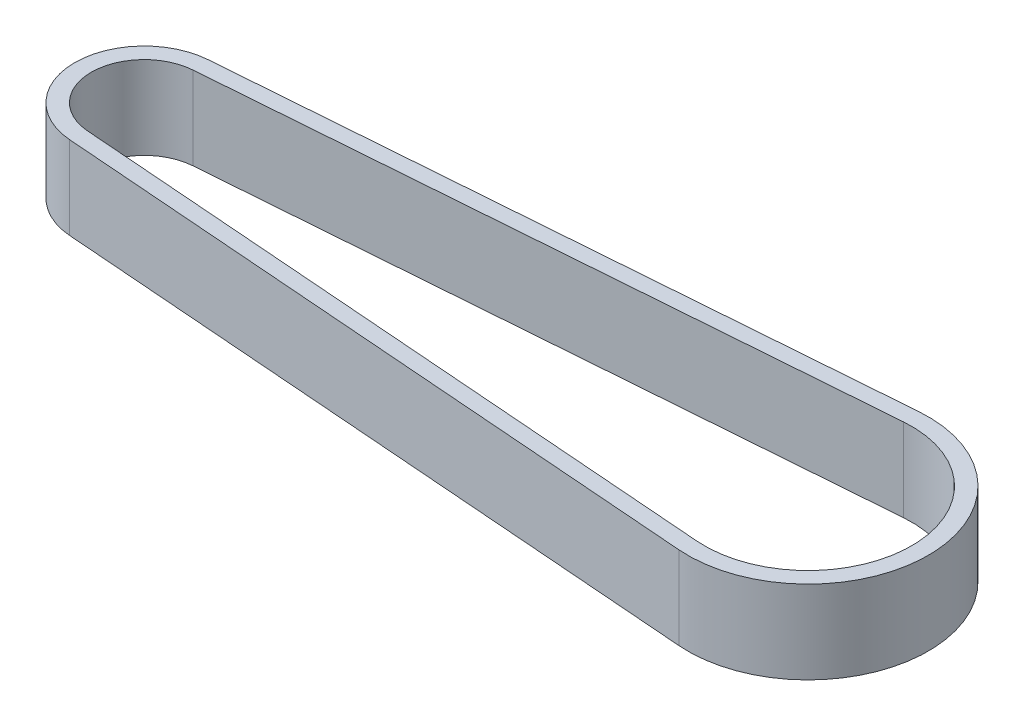
ISO-10303-21;
HEADER;
FILE_DESCRIPTION(('STEP AP214'),'2;1');
FILE_NAME('part.step','',(''),(''),'','','');
FILE_SCHEMA(('AUTOMOTIVE_DESIGN { 1 0 10303 214 1 1 1 1 }'));
ENDSEC;
DATA;
#1=APPLICATION_CONTEXT('core data for automotive mechanical design processes');
#2=APPLICATION_PROTOCOL_DEFINITION('international standard','automotive_design',2000,#1);
#3=PRODUCT_CONTEXT('',#1,'mechanical');
#4=PRODUCT('Part','Part','',(#3));
#5=PRODUCT_RELATED_PRODUCT_CATEGORY('part','',(#4));
#6=PRODUCT_DEFINITION_FORMATION('','',#4);
#7=PRODUCT_DEFINITION_CONTEXT('part definition',#1,'design');
#8=PRODUCT_DEFINITION('design','',#6,#7);
#9=PRODUCT_DEFINITION_SHAPE('','',#8);
#10=(LENGTH_UNIT() NAMED_UNIT(*) SI_UNIT(.MILLI.,.METRE.));
#11=(NAMED_UNIT(*) PLANE_ANGLE_UNIT() SI_UNIT($,.RADIAN.));
#12=(NAMED_UNIT(*) SI_UNIT($,.STERADIAN.) SOLID_ANGLE_UNIT());
#13=UNCERTAINTY_MEASURE_WITH_UNIT(LENGTH_MEASURE(1.E-05),#10,'distance_accuracy_value','');
#14=(GEOMETRIC_REPRESENTATION_CONTEXT(3) GLOBAL_UNCERTAINTY_ASSIGNED_CONTEXT((#13)) GLOBAL_UNIT_ASSIGNED_CONTEXT((#10,
#11,#12)) REPRESENTATION_CONTEXT('',''));
#15=CARTESIAN_POINT('',(0.,0.,0.));
#16=DIRECTION('',(0.,0.,1.));
#17=DIRECTION('',(1.,0.,0.));
#18=AXIS2_PLACEMENT_3D('',#15,#16,#17);
#19=CARTESIAN_POINT('',(0.,10.,0.));
#20=DIRECTION('',(0.,1.,0.));
#21=DIRECTION('',(0.,0.,1.));
#22=AXIS2_PLACEMENT_3D('',#19,#20,#21);
#23=PLANE('',#22);
#24=CARTESIAN_POINT('',(0.,10.,0.));
#25=DIRECTION('',(0.,1.,0.));
#26=DIRECTION('',(0.,0.,1.));
#27=AXIS2_PLACEMENT_3D('',#24,#25,#26);
#28=CIRCLE('',#27,8.37);
#29=CARTESIAN_POINT('',(-0.63925875,10.,-8.34555260306641));
#30=VERTEX_POINT('',#29);
#31=CARTESIAN_POINT('',(-0.63925875,10.,8.34555260306641));
#32=VERTEX_POINT('',#31);
#33=EDGE_CURVE('E134',#30,#32,#28,.T.);
#34=ORIENTED_EDGE('',*,*,#33,.T.);
#35=DIRECTION('',(0.997079164046165,0.,0.076375));
#36=VECTOR('',#35,1.);
#37=CARTESIAN_POINT('',(-0.63925875,10.,8.34555260306641));
#38=LINE('',#37,#36);
#39=CARTESIAN_POINT('',(78.89409,10.,14.4377062953885));
#40=VERTEX_POINT('',#39);
#41=EDGE_CURVE('E137',#32,#40,#38,.T.);
#42=ORIENTED_EDGE('',*,*,#41,.T.);
#43=CARTESIAN_POINT('',(80.,10.,0.));
#44=DIRECTION('',(0.,1.,0.));
#45=DIRECTION('',(0.,0.,1.));
#46=AXIS2_PLACEMENT_3D('',#43,#44,#45);
#47=CIRCLE('',#46,14.48);
#48=CARTESIAN_POINT('',(78.89409,10.,-14.4377062953885));
#49=VERTEX_POINT('',#48);
#50=EDGE_CURVE('E140',#40,#49,#47,.T.);
#51=ORIENTED_EDGE('',*,*,#50,.T.);
#52=DIRECTION('',(-0.997079164046165,0.,0.076375));
#53=VECTOR('',#52,1.);
#54=CARTESIAN_POINT('',(-0.63925875,10.,-8.34555260306641));
#55=LINE('',#54,#53);
#56=EDGE_CURVE('E142',#49,#30,#55,.T.);
#57=ORIENTED_EDGE('',*,*,#56,.T.);
#58=EDGE_LOOP('',(#34,#42,#51,#57));
#59=FACE_BOUND('',#58,.T.);
#60=DIRECTION('',(-0.997079164046165,0.,0.076375));
#61=VECTOR('',#60,1.);
#62=CARTESIAN_POINT('',(-0.48650875,10.,-6.35139427497407));
#63=LINE('',#62,#61);
#64=CARTESIAN_POINT('',(79.04684,10.,-12.4435479672961));
#65=VERTEX_POINT('',#64);
#66=CARTESIAN_POINT('',(-0.48650875,10.,-6.35139427497407));
#67=VERTEX_POINT('',#66);
#68=EDGE_CURVE('E106',#65,#67,#63,.T.);
#69=ORIENTED_EDGE('',*,*,#68,.F.);
#70=CARTESIAN_POINT('',(80.,10.,0.));
#71=DIRECTION('',(0.,1.,0.));
#72=DIRECTION('',(0.,0.,1.));
#73=AXIS2_PLACEMENT_3D('',#70,#71,#72);
#74=CIRCLE('',#73,12.48);
#75=CARTESIAN_POINT('',(79.04684,10.,12.4435479672961));
#76=VERTEX_POINT('',#75);
#77=EDGE_CURVE('E98',#76,#65,#74,.T.);
#78=ORIENTED_EDGE('',*,*,#77,.F.);
#79=DIRECTION('',(0.997079164046165,0.,0.076375));
#80=VECTOR('',#79,1.);
#81=CARTESIAN_POINT('',(-0.48650875,10.,6.35139427497407));
#82=LINE('',#81,#80);
#83=CARTESIAN_POINT('',(-0.486508750000002,10.,6.35139427497407));
#84=VERTEX_POINT('',#83);
#85=EDGE_CURVE('E120',#84,#76,#82,.T.);
#86=ORIENTED_EDGE('',*,*,#85,.F.);
#87=CARTESIAN_POINT('',(0.,10.,0.));
#88=DIRECTION('',(0.,1.,0.));
#89=DIRECTION('',(0.,0.,1.));
#90=AXIS2_PLACEMENT_3D('',#87,#88,#89);
#91=CIRCLE('',#90,6.37);
#92=EDGE_CURVE('E118',#67,#84,#91,.T.);
#93=ORIENTED_EDGE('',*,*,#92,.F.);
#94=EDGE_LOOP('',(#69,#78,#86,#93));
#95=FACE_BOUND('',#94,.T.);
#96=ADVANCED_FACE('F33',(#59,#95),#23,.T.);
#97=CARTESIAN_POINT('',(0.,0.,0.));
#98=DIRECTION('',(0.,1.,0.));
#99=DIRECTION('',(0.,0.,1.));
#100=AXIS2_PLACEMENT_3D('',#97,#98,#99);
#101=PLANE('',#100);
#102=CARTESIAN_POINT('',(0.,0.,0.));
#103=DIRECTION('',(0.,1.,0.));
#104=DIRECTION('',(0.,0.,1.));
#105=AXIS2_PLACEMENT_3D('',#102,#103,#104);
#106=CIRCLE('',#105,8.37);
#107=CARTESIAN_POINT('',(-0.63925875,0.,-8.34555260306641));
#108=VERTEX_POINT('',#107);
#109=CARTESIAN_POINT('',(-0.63925875,0.,8.34555260306641));
#110=VERTEX_POINT('',#109);
#111=EDGE_CURVE('E114',#108,#110,#106,.T.);
#112=ORIENTED_EDGE('',*,*,#111,.F.);
#113=DIRECTION('',(-0.997079164046165,0.,0.076375));
#114=VECTOR('',#113,1.);
#115=CARTESIAN_POINT('',(-0.63925875,0.,-8.34555260306641));
#116=LINE('',#115,#114);
#117=CARTESIAN_POINT('',(78.89409,0.,-14.4377062953885));
#118=VERTEX_POINT('',#117);
#119=EDGE_CURVE('E138',#118,#108,#116,.T.);
#120=ORIENTED_EDGE('',*,*,#119,.F.);
#121=CARTESIAN_POINT('',(80.,0.,0.));
#122=DIRECTION('',(0.,1.,0.));
#123=DIRECTION('',(0.,0.,1.));
#124=AXIS2_PLACEMENT_3D('',#121,#122,#123);
#125=CIRCLE('',#124,14.48);
#126=CARTESIAN_POINT('',(78.89409,0.,14.4377062953885));
#127=VERTEX_POINT('',#126);
#128=EDGE_CURVE('E149',#127,#118,#125,.T.);
#129=ORIENTED_EDGE('',*,*,#128,.F.);
#130=DIRECTION('',(0.997079164046165,0.,0.076375));
#131=VECTOR('',#130,1.);
#132=CARTESIAN_POINT('',(-0.63925875,0.,8.34555260306641));
#133=LINE('',#132,#131);
#134=EDGE_CURVE('E147',#110,#127,#133,.T.);
#135=ORIENTED_EDGE('',*,*,#134,.F.);
#136=EDGE_LOOP('',(#112,#120,#129,#135));
#137=FACE_BOUND('',#136,.T.);
#138=CARTESIAN_POINT('',(80.,0.,0.));
#139=DIRECTION('',(0.,1.,0.));
#140=DIRECTION('',(0.,0.,1.));
#141=AXIS2_PLACEMENT_3D('',#138,#139,#140);
#142=CIRCLE('',#141,12.48);
#143=CARTESIAN_POINT('',(79.04684,0.,12.4435479672961));
#144=VERTEX_POINT('',#143);
#145=CARTESIAN_POINT('',(79.04684,0.,-12.4435479672961));
#146=VERTEX_POINT('',#145);
#147=EDGE_CURVE('E56',#144,#146,#142,.T.);
#148=ORIENTED_EDGE('',*,*,#147,.T.);
#149=DIRECTION('',(-0.997079164046165,0.,0.076375));
#150=VECTOR('',#149,1.);
#151=CARTESIAN_POINT('',(-0.48650875,0.,-6.35139427497407));
#152=LINE('',#151,#150);
#153=CARTESIAN_POINT('',(-0.48650875,0.,-6.35139427497407));
#154=VERTEX_POINT('',#153);
#155=EDGE_CURVE('E113',#146,#154,#152,.T.);
#156=ORIENTED_EDGE('',*,*,#155,.T.);
#157=CARTESIAN_POINT('',(0.,0.,0.));
#158=DIRECTION('',(0.,1.,0.));
#159=DIRECTION('',(0.,0.,1.));
#160=AXIS2_PLACEMENT_3D('',#157,#158,#159);
#161=CIRCLE('',#160,6.37);
#162=CARTESIAN_POINT('',(-0.486508750000002,0.,6.35139427497407));
#163=VERTEX_POINT('',#162);
#164=EDGE_CURVE('E126',#154,#163,#161,.T.);
#165=ORIENTED_EDGE('',*,*,#164,.T.);
#166=DIRECTION('',(0.997079164046165,0.,0.076375));
#167=VECTOR('',#166,1.);
#168=CARTESIAN_POINT('',(-0.48650875,0.,6.35139427497407));
#169=LINE('',#168,#167);
#170=EDGE_CURVE('E107',#163,#144,#169,.T.);
#171=ORIENTED_EDGE('',*,*,#170,.T.);
#172=EDGE_LOOP('',(#148,#156,#165,#171));
#173=FACE_BOUND('',#172,.T.);
#174=ADVANCED_FACE('F167',(#137,#173),#101,.F.);
#175=CARTESIAN_POINT('',(0.,10.,0.));
#176=DIRECTION('',(0.,-1.,0.));
#177=DIRECTION('',(0.,0.,-1.));
#178=AXIS2_PLACEMENT_3D('',#175,#176,#177);
#179=CYLINDRICAL_SURFACE('',#178,8.37);
#180=ORIENTED_EDGE('',*,*,#111,.T.);
#181=DIRECTION('',(0.,-1.,0.));
#182=VECTOR('',#181,1.);
#183=CARTESIAN_POINT('',(-0.63925875,10.,8.34555260306641));
#184=LINE('',#183,#182);
#185=EDGE_CURVE('E11',#32,#110,#184,.T.);
#186=ORIENTED_EDGE('',*,*,#185,.F.);
#187=ORIENTED_EDGE('',*,*,#33,.F.);
#188=DIRECTION('',(0.,-1.,0.));
#189=VECTOR('',#188,1.);
#190=CARTESIAN_POINT('',(-0.63925875,10.,-8.34555260306641));
#191=LINE('',#190,#189);
#192=EDGE_CURVE('E144',#30,#108,#191,.T.);
#193=ORIENTED_EDGE('',*,*,#192,.T.);
#194=EDGE_LOOP('',(#180,#186,#187,#193));
#195=FACE_BOUND('',#194,.T.);
#196=ADVANCED_FACE('F35',(#195),#179,.T.);
#197=CARTESIAN_POINT('',(-0.63925875,10.,8.34555260306641));
#198=DIRECTION('',(0.076375,0.,-0.997079164046165));
#199=DIRECTION('',(-0.997079164046166,0.,-0.076375));
#200=AXIS2_PLACEMENT_3D('',#197,#198,#199);
#201=PLANE('',#200);
#202=ORIENTED_EDGE('',*,*,#134,.T.);
#203=DIRECTION('',(0.,-1.,0.));
#204=VECTOR('',#203,1.);
#205=CARTESIAN_POINT('',(78.89409,10.,14.4377062953885));
#206=LINE('',#205,#204);
#207=EDGE_CURVE('E41',#40,#127,#206,.T.);
#208=ORIENTED_EDGE('',*,*,#207,.F.);
#209=ORIENTED_EDGE('',*,*,#41,.F.);
#210=ORIENTED_EDGE('',*,*,#185,.T.);
#211=EDGE_LOOP('',(#202,#208,#209,#210));
#212=FACE_BOUND('',#211,.T.);
#213=ADVANCED_FACE('F177',(#212),#201,.F.);
#214=CARTESIAN_POINT('',(80.,10.,0.));
#215=DIRECTION('',(0.,-1.,0.));
#216=DIRECTION('',(0.,0.,-1.));
#217=AXIS2_PLACEMENT_3D('',#214,#215,#216);
#218=CYLINDRICAL_SURFACE('',#217,14.48);
#219=ORIENTED_EDGE('',*,*,#128,.T.);
#220=DIRECTION('',(0.,-1.,0.));
#221=VECTOR('',#220,1.);
#222=CARTESIAN_POINT('',(78.89409,10.,-14.4377062953885));
#223=LINE('',#222,#221);
#224=EDGE_CURVE('E154',#49,#118,#223,.T.);
#225=ORIENTED_EDGE('',*,*,#224,.F.);
#226=ORIENTED_EDGE('',*,*,#50,.F.);
#227=ORIENTED_EDGE('',*,*,#207,.T.);
#228=EDGE_LOOP('',(#219,#225,#226,#227));
#229=FACE_BOUND('',#228,.T.);
#230=ADVANCED_FACE('F161',(#229),#218,.T.);
#231=CARTESIAN_POINT('',(-0.63925875,10.,-8.34555260306641));
#232=DIRECTION('',(0.076375,0.,0.997079164046165));
#233=DIRECTION('',(0.997079164046166,0.,-0.076375));
#234=AXIS2_PLACEMENT_3D('',#231,#232,#233);
#235=PLANE('',#234);
#236=ORIENTED_EDGE('',*,*,#119,.T.);
#237=ORIENTED_EDGE('',*,*,#192,.F.);
#238=ORIENTED_EDGE('',*,*,#56,.F.);
#239=ORIENTED_EDGE('',*,*,#224,.T.);
#240=EDGE_LOOP('',(#236,#237,#238,#239));
#241=FACE_BOUND('',#240,.T.);
#242=ADVANCED_FACE('F171',(#241),#235,.F.);
#243=CARTESIAN_POINT('',(80.,10.,0.));
#244=DIRECTION('',(0.,-1.,0.));
#245=DIRECTION('',(0.,0.,-1.));
#246=AXIS2_PLACEMENT_3D('',#243,#244,#245);
#247=CYLINDRICAL_SURFACE('',#246,12.48);
#248=ORIENTED_EDGE('',*,*,#147,.F.);
#249=DIRECTION('',(0.,-1.,0.));
#250=VECTOR('',#249,1.);
#251=CARTESIAN_POINT('',(79.04684,10.,12.4435479672961));
#252=LINE('',#251,#250);
#253=EDGE_CURVE('E102',#76,#144,#252,.T.);
#254=ORIENTED_EDGE('',*,*,#253,.F.);
#255=ORIENTED_EDGE('',*,*,#77,.T.);
#256=DIRECTION('',(0.,-1.,0.));
#257=VECTOR('',#256,1.);
#258=CARTESIAN_POINT('',(79.04684,10.,-12.4435479672961));
#259=LINE('',#258,#257);
#260=EDGE_CURVE('E101',#65,#146,#259,.T.);
#261=ORIENTED_EDGE('',*,*,#260,.T.);
#262=EDGE_LOOP('',(#248,#254,#255,#261));
#263=FACE_BOUND('',#262,.T.);
#264=ADVANCED_FACE('F100',(#263),#247,.F.);
#265=CARTESIAN_POINT('',(-0.48650875,10.,-6.35139427497407));
#266=DIRECTION('',(0.076375,0.,0.997079164046165));
#267=DIRECTION('',(0.997079164046166,0.,-0.076375));
#268=AXIS2_PLACEMENT_3D('',#265,#266,#267);
#269=PLANE('',#268);
#270=ORIENTED_EDGE('',*,*,#155,.F.);
#271=ORIENTED_EDGE('',*,*,#260,.F.);
#272=ORIENTED_EDGE('',*,*,#68,.T.);
#273=DIRECTION('',(0.,-1.,0.));
#274=VECTOR('',#273,1.);
#275=CARTESIAN_POINT('',(-0.48650875,10.,-6.35139427497407));
#276=LINE('',#275,#274);
#277=EDGE_CURVE('E115',#67,#154,#276,.T.);
#278=ORIENTED_EDGE('',*,*,#277,.T.);
#279=EDGE_LOOP('',(#270,#271,#272,#278));
#280=FACE_BOUND('',#279,.T.);
#281=ADVANCED_FACE('F110',(#280),#269,.T.);
#282=CARTESIAN_POINT('',(0.,10.,0.));
#283=DIRECTION('',(0.,-1.,0.));
#284=DIRECTION('',(0.,0.,-1.));
#285=AXIS2_PLACEMENT_3D('',#282,#283,#284);
#286=CYLINDRICAL_SURFACE('',#285,6.37);
#287=ORIENTED_EDGE('',*,*,#164,.F.);
#288=ORIENTED_EDGE('',*,*,#277,.F.);
#289=ORIENTED_EDGE('',*,*,#92,.T.);
#290=DIRECTION('',(0.,-1.,0.));
#291=VECTOR('',#290,1.);
#292=CARTESIAN_POINT('',(-0.486508750000002,10.,6.35139427497407));
#293=LINE('',#292,#291);
#294=EDGE_CURVE('E48',#84,#163,#293,.T.);
#295=ORIENTED_EDGE('',*,*,#294,.T.);
#296=EDGE_LOOP('',(#287,#288,#289,#295));
#297=FACE_BOUND('',#296,.T.);
#298=ADVANCED_FACE('F200',(#297),#286,.F.);
#299=CARTESIAN_POINT('',(-0.48650875,10.,6.35139427497407));
#300=DIRECTION('',(0.076375,0.,-0.997079164046165));
#301=DIRECTION('',(-0.997079164046166,0.,-0.076375));
#302=AXIS2_PLACEMENT_3D('',#299,#300,#301);
#303=PLANE('',#302);
#304=ORIENTED_EDGE('',*,*,#170,.F.);
#305=ORIENTED_EDGE('',*,*,#294,.F.);
#306=ORIENTED_EDGE('',*,*,#85,.T.);
#307=ORIENTED_EDGE('',*,*,#253,.T.);
#308=EDGE_LOOP('',(#304,#305,#306,#307));
#309=FACE_BOUND('',#308,.T.);
#310=ADVANCED_FACE('F204',(#309),#303,.T.);
#311=CLOSED_SHELL('',(#96,#174,#196,#213,#230,#242,#264,#281,#298,#310));
#312=MANIFOLD_SOLID_BREP('B2',#311);
#313=ADVANCED_BREP_SHAPE_REPRESENTATION('',(#18,#312),#14);
#314=SHAPE_DEFINITION_REPRESENTATION(#9,#313);
ENDSEC;
END-ISO-10303-21;
